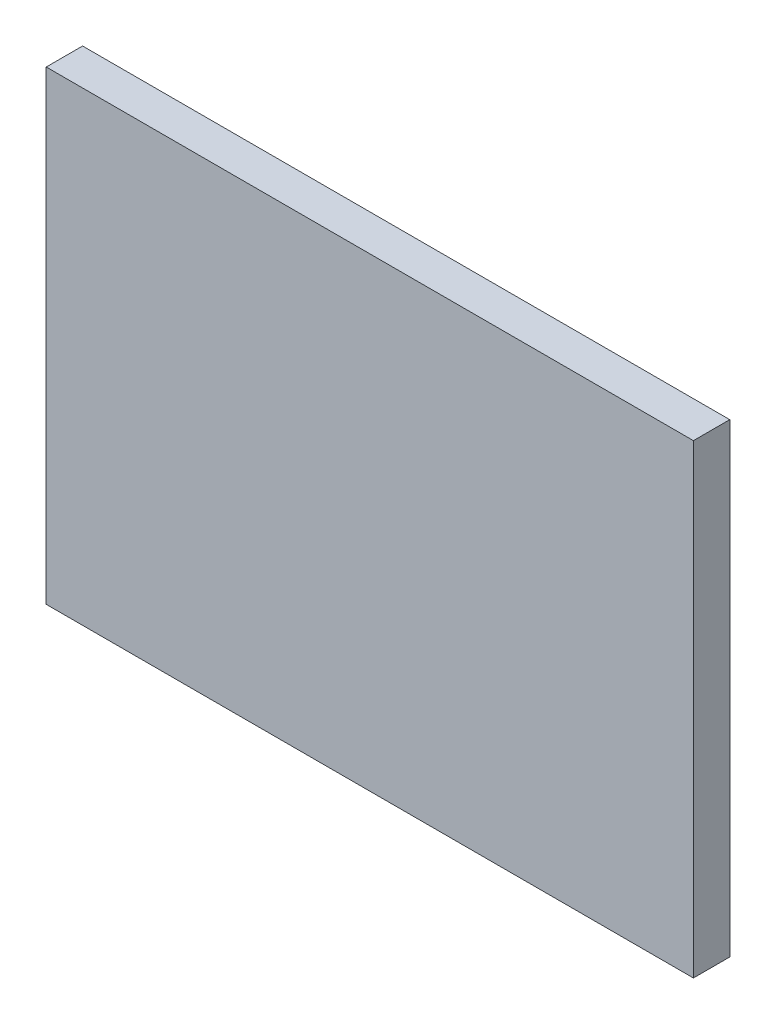
ISO-10303-21;
HEADER;
FILE_DESCRIPTION(('STEP AP214'),'2;1');
FILE_NAME('part.step','',(''),(''),'','','');
FILE_SCHEMA(('AUTOMOTIVE_DESIGN { 1 0 10303 214 1 1 1 1 }'));
ENDSEC;
DATA;
#1=APPLICATION_CONTEXT('core data for automotive mechanical design processes');
#2=APPLICATION_PROTOCOL_DEFINITION('international standard','automotive_design',2000,#1);
#3=PRODUCT_CONTEXT('',#1,'mechanical');
#4=PRODUCT('Part','Part','',(#3));
#5=PRODUCT_RELATED_PRODUCT_CATEGORY('part','',(#4));
#6=PRODUCT_DEFINITION_FORMATION('','',#4);
#7=PRODUCT_DEFINITION_CONTEXT('part definition',#1,'design');
#8=PRODUCT_DEFINITION('design','',#6,#7);
#9=PRODUCT_DEFINITION_SHAPE('','',#8);
#10=(LENGTH_UNIT() NAMED_UNIT(*) SI_UNIT(.MILLI.,.METRE.));
#11=(NAMED_UNIT(*) PLANE_ANGLE_UNIT() SI_UNIT($,.RADIAN.));
#12=(NAMED_UNIT(*) SI_UNIT($,.STERADIAN.) SOLID_ANGLE_UNIT());
#13=UNCERTAINTY_MEASURE_WITH_UNIT(LENGTH_MEASURE(1.E-05),#10,'distance_accuracy_value','');
#14=(GEOMETRIC_REPRESENTATION_CONTEXT(3) GLOBAL_UNCERTAINTY_ASSIGNED_CONTEXT((#13)) GLOBAL_UNIT_ASSIGNED_CONTEXT((#10,
#11,#12)) REPRESENTATION_CONTEXT('',''));
#15=CARTESIAN_POINT('',(0.,0.,0.));
#16=DIRECTION('',(0.,0.,1.));
#17=DIRECTION('',(1.,0.,0.));
#18=AXIS2_PLACEMENT_3D('',#15,#16,#17);
#19=CARTESIAN_POINT('',(0.,0.,0.1));
#20=DIRECTION('',(0.,0.,1.));
#21=DIRECTION('',(1.,0.,0.));
#22=AXIS2_PLACEMENT_3D('',#19,#20,#21);
#23=PLANE('',#22);
#24=DIRECTION('',(0.,1.,0.));
#25=VECTOR('',#24,1.);
#26=CARTESIAN_POINT('',(1.78,0.,0.1));
#27=LINE('',#26,#25);
#28=CARTESIAN_POINT('',(1.78,1.28,0.1));
#29=VERTEX_POINT('',#28);
#30=CARTESIAN_POINT('',(1.78,0.,0.1));
#31=VERTEX_POINT('',#30);
#32=EDGE_CURVE('E76',#29,#31,#27,.F.);
#33=ORIENTED_EDGE('',*,*,#32,.F.);
#34=DIRECTION('',(1.,0.,0.));
#35=VECTOR('',#34,1.);
#36=CARTESIAN_POINT('',(0.,1.28,0.1));
#37=LINE('',#36,#35);
#38=CARTESIAN_POINT('',(0.,1.28,0.1));
#39=VERTEX_POINT('',#38);
#40=EDGE_CURVE('E58',#39,#29,#37,.T.);
#41=ORIENTED_EDGE('',*,*,#40,.F.);
#42=DIRECTION('',(0.,1.,0.));
#43=VECTOR('',#42,1.);
#44=CARTESIAN_POINT('',(0.,0.,0.1));
#45=LINE('',#44,#43);
#46=CARTESIAN_POINT('',(0.,0.,0.1));
#47=VERTEX_POINT('',#46);
#48=EDGE_CURVE('E20',#39,#47,#45,.F.);
#49=ORIENTED_EDGE('',*,*,#48,.T.);
#50=DIRECTION('',(1.,0.,0.));
#51=VECTOR('',#50,1.);
#52=CARTESIAN_POINT('',(0.,0.,0.1));
#53=LINE('',#52,#51);
#54=EDGE_CURVE('E55',#47,#31,#53,.T.);
#55=ORIENTED_EDGE('',*,*,#54,.T.);
#56=EDGE_LOOP('',(#33,#41,#49,#55));
#57=FACE_BOUND('',#56,.T.);
#58=ADVANCED_FACE('F17',(#57),#23,.T.);
#59=CARTESIAN_POINT('',(0.,0.,0.));
#60=DIRECTION('',(1.,0.,0.));
#61=DIRECTION('',(0.,0.,-1.));
#62=AXIS2_PLACEMENT_3D('',#59,#60,#61);
#63=PLANE('',#62);
#64=DIRECTION('',(0.,0.,1.));
#65=VECTOR('',#64,1.);
#66=CARTESIAN_POINT('',(0.,1.28,0.));
#67=LINE('',#66,#65);
#68=CARTESIAN_POINT('',(0.,1.28,0.));
#69=VERTEX_POINT('',#68);
#70=EDGE_CURVE('E78',#69,#39,#67,.T.);
#71=ORIENTED_EDGE('',*,*,#70,.F.);
#72=DIRECTION('',(0.,1.,0.));
#73=VECTOR('',#72,1.);
#74=CARTESIAN_POINT('',(0.,0.,0.));
#75=LINE('',#74,#73);
#76=CARTESIAN_POINT('',(0.,0.,0.));
#77=VERTEX_POINT('',#76);
#78=EDGE_CURVE('E73',#69,#77,#75,.F.);
#79=ORIENTED_EDGE('',*,*,#78,.T.);
#80=DIRECTION('',(0.,0.,1.));
#81=VECTOR('',#80,1.);
#82=CARTESIAN_POINT('',(0.,0.,0.));
#83=LINE('',#82,#81);
#84=EDGE_CURVE('E63',#77,#47,#83,.T.);
#85=ORIENTED_EDGE('',*,*,#84,.T.);
#86=ORIENTED_EDGE('',*,*,#48,.F.);
#87=EDGE_LOOP('',(#71,#79,#85,#86));
#88=FACE_BOUND('',#87,.T.);
#89=ADVANCED_FACE('F72',(#88),#63,.F.);
#90=CARTESIAN_POINT('',(0.,0.,0.));
#91=DIRECTION('',(0.,1.,0.));
#92=DIRECTION('',(0.,0.,1.));
#93=AXIS2_PLACEMENT_3D('',#90,#91,#92);
#94=PLANE('',#93);
#95=ORIENTED_EDGE('',*,*,#54,.F.);
#96=ORIENTED_EDGE('',*,*,#84,.F.);
#97=DIRECTION('',(1.,0.,0.));
#98=VECTOR('',#97,1.);
#99=CARTESIAN_POINT('',(0.,0.,0.));
#100=LINE('',#99,#98);
#101=CARTESIAN_POINT('',(1.78,0.,0.));
#102=VERTEX_POINT('',#101);
#103=EDGE_CURVE('E83',#77,#102,#100,.T.);
#104=ORIENTED_EDGE('',*,*,#103,.T.);
#105=DIRECTION('',(0.,0.,-1.));
#106=VECTOR('',#105,1.);
#107=CARTESIAN_POINT('',(1.78,0.,0.));
#108=LINE('',#107,#106);
#109=EDGE_CURVE('E69',#31,#102,#108,.T.);
#110=ORIENTED_EDGE('',*,*,#109,.F.);
#111=EDGE_LOOP('',(#95,#96,#104,#110));
#112=FACE_BOUND('',#111,.T.);
#113=ADVANCED_FACE('F66',(#112),#94,.F.);
#114=CARTESIAN_POINT('',(1.78,0.,0.));
#115=DIRECTION('',(1.,0.,0.));
#116=DIRECTION('',(0.,0.,-1.));
#117=AXIS2_PLACEMENT_3D('',#114,#115,#116);
#118=PLANE('',#117);
#119=DIRECTION('',(0.,0.,1.));
#120=VECTOR('',#119,1.);
#121=CARTESIAN_POINT('',(1.78,1.28,0.));
#122=LINE('',#121,#120);
#123=CARTESIAN_POINT('',(1.78,1.28,0.));
#124=VERTEX_POINT('',#123);
#125=EDGE_CURVE('E34',#29,#124,#122,.F.);
#126=ORIENTED_EDGE('',*,*,#125,.F.);
#127=ORIENTED_EDGE('',*,*,#32,.T.);
#128=ORIENTED_EDGE('',*,*,#109,.T.);
#129=DIRECTION('',(0.,1.,0.));
#130=VECTOR('',#129,1.);
#131=CARTESIAN_POINT('',(1.78,0.,0.));
#132=LINE('',#131,#130);
#133=EDGE_CURVE('E26',#102,#124,#132,.T.);
#134=ORIENTED_EDGE('',*,*,#133,.T.);
#135=EDGE_LOOP('',(#126,#127,#128,#134));
#136=FACE_BOUND('',#135,.T.);
#137=ADVANCED_FACE('F88',(#136),#118,.T.);
#138=CARTESIAN_POINT('',(0.,1.28,0.));
#139=DIRECTION('',(0.,1.,0.));
#140=DIRECTION('',(0.,0.,1.));
#141=AXIS2_PLACEMENT_3D('',#138,#139,#140);
#142=PLANE('',#141);
#143=ORIENTED_EDGE('',*,*,#40,.T.);
#144=ORIENTED_EDGE('',*,*,#125,.T.);
#145=DIRECTION('',(1.,0.,0.));
#146=VECTOR('',#145,1.);
#147=CARTESIAN_POINT('',(0.,1.28,0.));
#148=LINE('',#147,#146);
#149=EDGE_CURVE('E11',#124,#69,#148,.F.);
#150=ORIENTED_EDGE('',*,*,#149,.T.);
#151=ORIENTED_EDGE('',*,*,#70,.T.);
#152=EDGE_LOOP('',(#143,#144,#150,#151));
#153=FACE_BOUND('',#152,.T.);
#154=ADVANCED_FACE('F91',(#153),#142,.T.);
#155=CARTESIAN_POINT('',(0.,0.,0.));
#156=DIRECTION('',(0.,0.,1.));
#157=DIRECTION('',(1.,0.,0.));
#158=AXIS2_PLACEMENT_3D('',#155,#156,#157);
#159=PLANE('',#158);
#160=ORIENTED_EDGE('',*,*,#133,.F.);
#161=ORIENTED_EDGE('',*,*,#103,.F.);
#162=ORIENTED_EDGE('',*,*,#78,.F.);
#163=ORIENTED_EDGE('',*,*,#149,.F.);
#164=EDGE_LOOP('',(#160,#161,#162,#163));
#165=FACE_BOUND('',#164,.T.);
#166=ADVANCED_FACE('F90',(#165),#159,.F.);
#167=CLOSED_SHELL('',(#58,#89,#113,#137,#154,#166));
#168=MANIFOLD_SOLID_BREP('B1',#167);
#169=ADVANCED_BREP_SHAPE_REPRESENTATION('',(#18,#168),#14);
#170=SHAPE_DEFINITION_REPRESENTATION(#9,#169);
ENDSEC;
END-ISO-10303-21;
